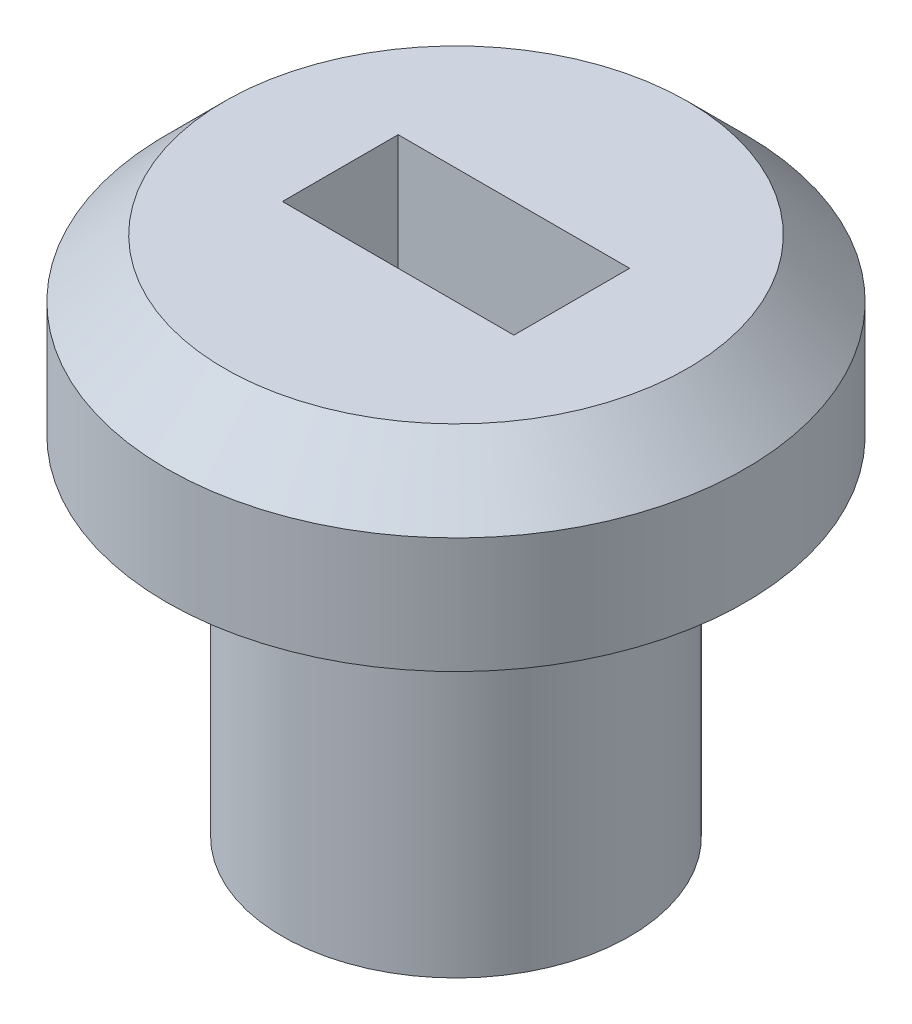
ISO-10303-21;
HEADER;
FILE_DESCRIPTION(('STEP AP214'),'2;1');
FILE_NAME('part.step','',(''),(''),'','','');
FILE_SCHEMA(('AUTOMOTIVE_DESIGN { 1 0 10303 214 1 1 1 1 }'));
ENDSEC;
DATA;
#1=APPLICATION_CONTEXT('core data for automotive mechanical design processes');
#2=APPLICATION_PROTOCOL_DEFINITION('international standard','automotive_design',2000,#1);
#3=PRODUCT_CONTEXT('',#1,'mechanical');
#4=PRODUCT('Part','Part','',(#3));
#5=PRODUCT_RELATED_PRODUCT_CATEGORY('part','',(#4));
#6=PRODUCT_DEFINITION_FORMATION('','',#4);
#7=PRODUCT_DEFINITION_CONTEXT('part definition',#1,'design');
#8=PRODUCT_DEFINITION('design','',#6,#7);
#9=PRODUCT_DEFINITION_SHAPE('','',#8);
#10=(LENGTH_UNIT() NAMED_UNIT(*) SI_UNIT(.MILLI.,.METRE.));
#11=(NAMED_UNIT(*) PLANE_ANGLE_UNIT() SI_UNIT($,.RADIAN.));
#12=(NAMED_UNIT(*) SI_UNIT($,.STERADIAN.) SOLID_ANGLE_UNIT());
#13=UNCERTAINTY_MEASURE_WITH_UNIT(LENGTH_MEASURE(1.E-05),#10,'distance_accuracy_value','');
#14=(GEOMETRIC_REPRESENTATION_CONTEXT(3) GLOBAL_UNCERTAINTY_ASSIGNED_CONTEXT((#13)) GLOBAL_UNIT_ASSIGNED_CONTEXT((#10,
#11,#12)) REPRESENTATION_CONTEXT('',''));
#15=CARTESIAN_POINT('',(0.,0.,0.));
#16=DIRECTION('',(0.,0.,1.));
#17=DIRECTION('',(1.,0.,0.));
#18=AXIS2_PLACEMENT_3D('',#15,#16,#17);
#19=CARTESIAN_POINT('',(-0.499999999999999,4.5,0.));
#20=DIRECTION('',(0.,-1.,0.));
#21=DIRECTION('',(0.,0.,-1.));
#22=AXIS2_PLACEMENT_3D('',#19,#20,#21);
#23=PLANE('',#22);
#24=CARTESIAN_POINT('',(0.,4.5,0.));
#25=DIRECTION('',(0.,-1.,0.));
#26=DIRECTION('',(0.,0.,-1.));
#27=AXIS2_PLACEMENT_3D('',#24,#25,#26);
#28=CIRCLE('',#27,2.);
#29=CARTESIAN_POINT('',(0.,4.5,-2.));
#30=VERTEX_POINT('',#29);
#31=EDGE_CURVE('E120',#30,#30,#28,.F.);
#32=ORIENTED_EDGE('',*,*,#31,.T.);
#33=EDGE_LOOP('',(#32));
#34=FACE_BOUND('',#33,.T.);
#35=DIRECTION('',(-1.,0.,0.));
#36=VECTOR('',#35,1.);
#37=CARTESIAN_POINT('',(-0.499999999999999,4.5,0.5));
#38=LINE('',#37,#36);
#39=CARTESIAN_POINT('',(1.,4.5,0.5));
#40=VERTEX_POINT('',#39);
#41=CARTESIAN_POINT('',(-1.,4.5,0.5));
#42=VERTEX_POINT('',#41);
#43=EDGE_CURVE('E41',#40,#42,#38,.T.);
#44=ORIENTED_EDGE('',*,*,#43,.T.);
#45=DIRECTION('',(0.,0.,1.));
#46=VECTOR('',#45,1.);
#47=CARTESIAN_POINT('',(-1.,4.5,-0.5));
#48=LINE('',#47,#46);
#49=CARTESIAN_POINT('',(-1.,4.5,-0.5));
#50=VERTEX_POINT('',#49);
#51=EDGE_CURVE('E100',#50,#42,#48,.T.);
#52=ORIENTED_EDGE('',*,*,#51,.F.);
#53=DIRECTION('',(1.,0.,0.));
#54=VECTOR('',#53,1.);
#55=CARTESIAN_POINT('',(-0.499999999999999,4.5,-0.5));
#56=LINE('',#55,#54);
#57=CARTESIAN_POINT('',(1.,4.5,-0.5));
#58=VERTEX_POINT('',#57);
#59=EDGE_CURVE('E11',#50,#58,#56,.T.);
#60=ORIENTED_EDGE('',*,*,#59,.T.);
#61=DIRECTION('',(0.,0.,-1.));
#62=VECTOR('',#61,1.);
#63=CARTESIAN_POINT('',(1.,4.5,-0.5));
#64=LINE('',#63,#62);
#65=EDGE_CURVE('E102',#40,#58,#64,.T.);
#66=ORIENTED_EDGE('',*,*,#65,.F.);
#67=EDGE_LOOP('',(#44,#52,#60,#66));
#68=FACE_BOUND('',#67,.T.);
#69=ADVANCED_FACE('F33',(#34,#68),#23,.F.);
#70=CARTESIAN_POINT('',(0.,0.,0.));
#71=DIRECTION('',(0.,-1.,0.));
#72=DIRECTION('',(0.,0.,-1.));
#73=AXIS2_PLACEMENT_3D('',#70,#71,#72);
#74=CYLINDRICAL_SURFACE('',#73,2.5);
#75=CARTESIAN_POINT('',(0.,4.,0.));
#76=DIRECTION('',(0.,-1.,0.));
#77=DIRECTION('',(0.,0.,-1.));
#78=AXIS2_PLACEMENT_3D('',#75,#76,#77);
#79=CIRCLE('',#78,2.5);
#80=CARTESIAN_POINT('',(0.,4.,-2.5));
#81=VERTEX_POINT('',#80);
#82=EDGE_CURVE('E117',#81,#81,#79,.T.);
#83=ORIENTED_EDGE('',*,*,#82,.T.);
#84=EDGE_LOOP('',(#83));
#85=FACE_BOUND('',#84,.T.);
#86=CARTESIAN_POINT('',(0.,3.,0.));
#87=DIRECTION('',(0.,-1.,0.));
#88=DIRECTION('',(0.,0.,-1.));
#89=AXIS2_PLACEMENT_3D('',#86,#87,#88);
#90=CIRCLE('',#89,2.5);
#91=CARTESIAN_POINT('',(0.,3.,-2.5));
#92=VERTEX_POINT('',#91);
#93=EDGE_CURVE('E114',#92,#92,#90,.T.);
#94=ORIENTED_EDGE('',*,*,#93,.F.);
#95=EDGE_LOOP('',(#94));
#96=FACE_BOUND('',#95,.T.);
#97=ADVANCED_FACE('F131',(#85,#96),#74,.T.);
#98=CARTESIAN_POINT('',(-2.5,3.,0.));
#99=DIRECTION('',(0.,1.,0.));
#100=DIRECTION('',(0.,0.,1.));
#101=AXIS2_PLACEMENT_3D('',#98,#99,#100);
#102=PLANE('',#101);
#103=CARTESIAN_POINT('',(0.,3.,0.));
#104=DIRECTION('',(0.,-1.,0.));
#105=DIRECTION('',(0.,0.,-1.));
#106=AXIS2_PLACEMENT_3D('',#103,#104,#105);
#107=CIRCLE('',#106,1.5);
#108=CARTESIAN_POINT('',(0.,3.,-1.5));
#109=VERTEX_POINT('',#108);
#110=EDGE_CURVE('E111',#109,#109,#107,.T.);
#111=ORIENTED_EDGE('',*,*,#110,.F.);
#112=EDGE_LOOP('',(#111));
#113=FACE_BOUND('',#112,.T.);
#114=ORIENTED_EDGE('',*,*,#93,.T.);
#115=EDGE_LOOP('',(#114));
#116=FACE_BOUND('',#115,.T.);
#117=ADVANCED_FACE('F134',(#113,#116),#102,.F.);
#118=CARTESIAN_POINT('',(0.,0.,0.));
#119=DIRECTION('',(0.,-1.,0.));
#120=DIRECTION('',(0.,0.,-1.));
#121=AXIS2_PLACEMENT_3D('',#118,#119,#120);
#122=CYLINDRICAL_SURFACE('',#121,1.5);
#123=CARTESIAN_POINT('',(0.,0.,0.));
#124=DIRECTION('',(0.,-1.,0.));
#125=DIRECTION('',(0.,0.,-1.));
#126=AXIS2_PLACEMENT_3D('',#123,#124,#125);
#127=CIRCLE('',#126,1.5);
#128=CARTESIAN_POINT('',(0.,0.,-1.5));
#129=VERTEX_POINT('',#128);
#130=EDGE_CURVE('E106',#129,#129,#127,.T.);
#131=ORIENTED_EDGE('',*,*,#130,.F.);
#132=EDGE_LOOP('',(#131));
#133=FACE_BOUND('',#132,.T.);
#134=ORIENTED_EDGE('',*,*,#110,.T.);
#135=EDGE_LOOP('',(#134));
#136=FACE_BOUND('',#135,.T.);
#137=ADVANCED_FACE('F139',(#133,#136),#122,.T.);
#138=CARTESIAN_POINT('',(-1.5,0.,0.));
#139=DIRECTION('',(0.,1.,0.));
#140=DIRECTION('',(0.,0.,1.));
#141=AXIS2_PLACEMENT_3D('',#138,#139,#140);
#142=PLANE('',#141);
#143=ORIENTED_EDGE('',*,*,#130,.T.);
#144=EDGE_LOOP('',(#143));
#145=FACE_BOUND('',#144,.T.);
#146=ADVANCED_FACE('F128',(#145),#142,.F.);
#147=CARTESIAN_POINT('',(0.,4.,0.));
#148=DIRECTION('',(0.,-1.,0.));
#149=DIRECTION('',(0.,0.,-1.));
#150=AXIS2_PLACEMENT_3D('',#147,#148,#149);
#151=CONICAL_SURFACE('',#150,2.5,0.785398163397451);
#152=ORIENTED_EDGE('',*,*,#31,.F.);
#153=EDGE_LOOP('',(#152));
#154=FACE_BOUND('',#153,.T.);
#155=ORIENTED_EDGE('',*,*,#82,.F.);
#156=EDGE_LOOP('',(#155));
#157=FACE_BOUND('',#156,.T.);
#158=ADVANCED_FACE('F35',(#154,#157),#151,.T.);
#159=CARTESIAN_POINT('',(-1.,3.5,-0.5));
#160=DIRECTION('',(0.,0.,-1.));
#161=DIRECTION('',(-1.,0.,0.));
#162=AXIS2_PLACEMENT_3D('',#159,#160,#161);
#163=PLANE('',#162);
#164=DIRECTION('',(-1.,0.,0.));
#165=VECTOR('',#164,1.);
#166=CARTESIAN_POINT('',(-1.,3.5,-0.5));
#167=LINE('',#166,#165);
#168=CARTESIAN_POINT('',(1.,3.5,-0.5));
#169=VERTEX_POINT('',#168);
#170=CARTESIAN_POINT('',(-1.,3.5,-0.5));
#171=VERTEX_POINT('',#170);
#172=EDGE_CURVE('E56',#169,#171,#167,.T.);
#173=ORIENTED_EDGE('',*,*,#172,.F.);
#174=DIRECTION('',(0.,1.,0.));
#175=VECTOR('',#174,1.);
#176=CARTESIAN_POINT('',(1.,3.5,-0.5));
#177=LINE('',#176,#175);
#178=EDGE_CURVE('E93',#169,#58,#177,.T.);
#179=ORIENTED_EDGE('',*,*,#178,.T.);
#180=ORIENTED_EDGE('',*,*,#59,.F.);
#181=DIRECTION('',(0.,1.,0.));
#182=VECTOR('',#181,1.);
#183=CARTESIAN_POINT('',(-1.,3.5,-0.5));
#184=LINE('',#183,#182);
#185=EDGE_CURVE('E104',#171,#50,#184,.T.);
#186=ORIENTED_EDGE('',*,*,#185,.F.);
#187=EDGE_LOOP('',(#173,#179,#180,#186));
#188=FACE_BOUND('',#187,.T.);
#189=ADVANCED_FACE('F127',(#188),#163,.F.);
#190=CARTESIAN_POINT('',(-1.,3.5,0.5));
#191=DIRECTION('',(0.,0.,1.));
#192=DIRECTION('',(1.,0.,0.));
#193=AXIS2_PLACEMENT_3D('',#190,#191,#192);
#194=PLANE('',#193);
#195=DIRECTION('',(1.,0.,0.));
#196=VECTOR('',#195,1.);
#197=CARTESIAN_POINT('',(-1.,3.5,0.5));
#198=LINE('',#197,#196);
#199=CARTESIAN_POINT('',(-1.,3.5,0.5));
#200=VERTEX_POINT('',#199);
#201=CARTESIAN_POINT('',(1.,3.5,0.5));
#202=VERTEX_POINT('',#201);
#203=EDGE_CURVE('E80',#200,#202,#198,.T.);
#204=ORIENTED_EDGE('',*,*,#203,.F.);
#205=DIRECTION('',(0.,1.,0.));
#206=VECTOR('',#205,1.);
#207=CARTESIAN_POINT('',(-1.,3.5,0.5));
#208=LINE('',#207,#206);
#209=EDGE_CURVE('E77',#200,#42,#208,.T.);
#210=ORIENTED_EDGE('',*,*,#209,.T.);
#211=ORIENTED_EDGE('',*,*,#43,.F.);
#212=DIRECTION('',(0.,1.,0.));
#213=VECTOR('',#212,1.);
#214=CARTESIAN_POINT('',(1.,3.5,0.5));
#215=LINE('',#214,#213);
#216=EDGE_CURVE('E89',#202,#40,#215,.T.);
#217=ORIENTED_EDGE('',*,*,#216,.F.);
#218=EDGE_LOOP('',(#204,#210,#211,#217));
#219=FACE_BOUND('',#218,.T.);
#220=ADVANCED_FACE('F90',(#219),#194,.F.);
#221=CARTESIAN_POINT('',(-1.,3.5,-0.5));
#222=DIRECTION('',(-1.,0.,0.));
#223=DIRECTION('',(0.,0.,1.));
#224=AXIS2_PLACEMENT_3D('',#221,#222,#223);
#225=PLANE('',#224);
#226=ORIENTED_EDGE('',*,*,#51,.T.);
#227=ORIENTED_EDGE('',*,*,#209,.F.);
#228=DIRECTION('',(0.,0.,1.));
#229=VECTOR('',#228,1.);
#230=CARTESIAN_POINT('',(-1.,3.5,-0.5));
#231=LINE('',#230,#229);
#232=EDGE_CURVE('E85',#171,#200,#231,.T.);
#233=ORIENTED_EDGE('',*,*,#232,.F.);
#234=ORIENTED_EDGE('',*,*,#185,.T.);
#235=EDGE_LOOP('',(#226,#227,#233,#234));
#236=FACE_BOUND('',#235,.T.);
#237=ADVANCED_FACE('F156',(#236),#225,.F.);
#238=CARTESIAN_POINT('',(1.,3.5,-0.5));
#239=DIRECTION('',(1.,0.,0.));
#240=DIRECTION('',(0.,0.,-1.));
#241=AXIS2_PLACEMENT_3D('',#238,#239,#240);
#242=PLANE('',#241);
#243=ORIENTED_EDGE('',*,*,#65,.T.);
#244=ORIENTED_EDGE('',*,*,#178,.F.);
#245=DIRECTION('',(0.,0.,-1.));
#246=VECTOR('',#245,1.);
#247=CARTESIAN_POINT('',(1.,3.5,-0.5));
#248=LINE('',#247,#246);
#249=EDGE_CURVE('E84',#202,#169,#248,.T.);
#250=ORIENTED_EDGE('',*,*,#249,.F.);
#251=ORIENTED_EDGE('',*,*,#216,.T.);
#252=EDGE_LOOP('',(#243,#244,#250,#251));
#253=FACE_BOUND('',#252,.T.);
#254=ADVANCED_FACE('F95',(#253),#242,.F.);
#255=CARTESIAN_POINT('',(0.,3.5,0.));
#256=DIRECTION('',(0.,-1.,0.));
#257=DIRECTION('',(0.,0.,-1.));
#258=AXIS2_PLACEMENT_3D('',#255,#256,#257);
#259=PLANE('',#258);
#260=ORIENTED_EDGE('',*,*,#172,.T.);
#261=ORIENTED_EDGE('',*,*,#232,.T.);
#262=ORIENTED_EDGE('',*,*,#203,.T.);
#263=ORIENTED_EDGE('',*,*,#249,.T.);
#264=EDGE_LOOP('',(#260,#261,#262,#263));
#265=FACE_BOUND('',#264,.T.);
#266=ADVANCED_FACE('F82',(#265),#259,.F.);
#267=CLOSED_SHELL('',(#69,#97,#117,#137,#146,#158,#189,#220,#237,#254,#266));
#268=MANIFOLD_SOLID_BREP('B2',#267);
#269=ADVANCED_BREP_SHAPE_REPRESENTATION('',(#18,#268),#14);
#270=SHAPE_DEFINITION_REPRESENTATION(#9,#269);
ENDSEC;
END-ISO-10303-21;
